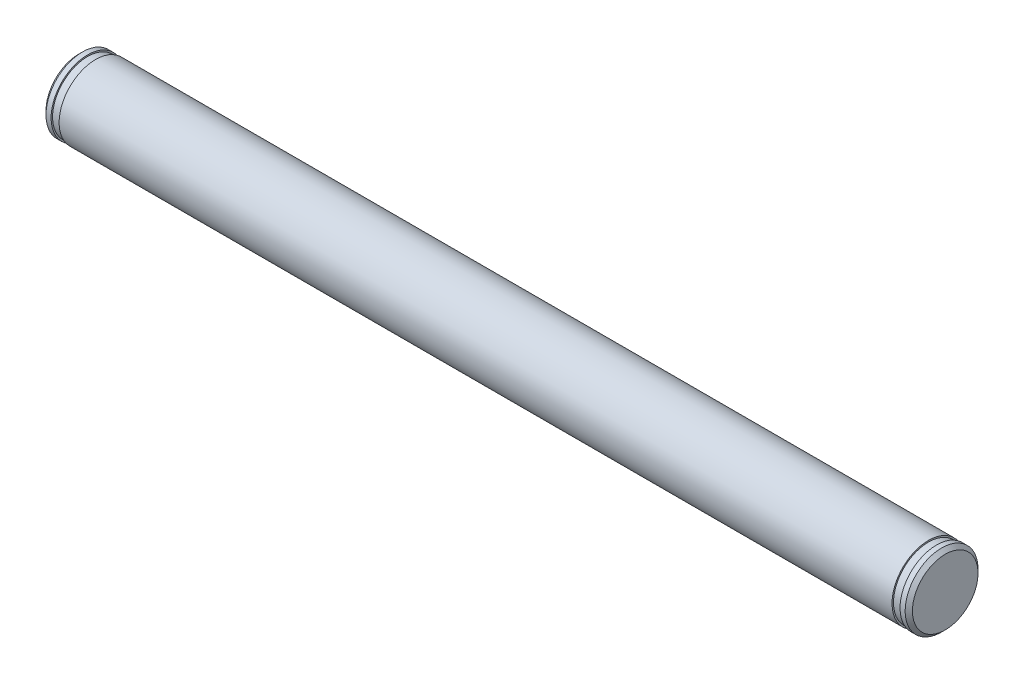
ISO-10303-21;
HEADER;
FILE_DESCRIPTION(('STEP AP214'),'2;1');
FILE_NAME('part.step','',(''),(''),'','','');
FILE_SCHEMA(('AUTOMOTIVE_DESIGN { 1 0 10303 214 1 1 1 1 }'));
ENDSEC;
DATA;
#1=APPLICATION_CONTEXT('core data for automotive mechanical design processes');
#2=APPLICATION_PROTOCOL_DEFINITION('international standard','automotive_design',2000,#1);
#3=PRODUCT_CONTEXT('',#1,'mechanical');
#4=PRODUCT('Part','Part','',(#3));
#5=PRODUCT_RELATED_PRODUCT_CATEGORY('part','',(#4));
#6=PRODUCT_DEFINITION_FORMATION('','',#4);
#7=PRODUCT_DEFINITION_CONTEXT('part definition',#1,'design');
#8=PRODUCT_DEFINITION('design','',#6,#7);
#9=PRODUCT_DEFINITION_SHAPE('','',#8);
#10=(LENGTH_UNIT() NAMED_UNIT(*) SI_UNIT(.MILLI.,.METRE.));
#11=(NAMED_UNIT(*) PLANE_ANGLE_UNIT() SI_UNIT($,.RADIAN.));
#12=(NAMED_UNIT(*) SI_UNIT($,.STERADIAN.) SOLID_ANGLE_UNIT());
#13=UNCERTAINTY_MEASURE_WITH_UNIT(LENGTH_MEASURE(1.E-05),#10,'distance_accuracy_value','');
#14=(GEOMETRIC_REPRESENTATION_CONTEXT(3) GLOBAL_UNCERTAINTY_ASSIGNED_CONTEXT((#13)) GLOBAL_UNIT_ASSIGNED_CONTEXT((#10,
#11,#12)) REPRESENTATION_CONTEXT('',''));
#15=CARTESIAN_POINT('',(0.,0.,0.));
#16=DIRECTION('',(0.,0.,1.));
#17=DIRECTION('',(1.,0.,0.));
#18=AXIS2_PLACEMENT_3D('',#15,#16,#17);
#19=CARTESIAN_POINT('',(-59.45,0.,0.));
#20=DIRECTION('',(-1.,0.,0.));
#21=DIRECTION('',(0.,-1.,0.));
#22=AXIS2_PLACEMENT_3D('',#19,#20,#21);
#23=PLANE('',#22);
#24=CARTESIAN_POINT('',(-59.45,0.,0.));
#25=DIRECTION('',(-1.,0.,0.));
#26=DIRECTION('',(0.,-1.,0.));
#27=AXIS2_PLACEMENT_3D('',#24,#25,#26);
#28=CIRCLE('',#27,4.49999999999999);
#29=CARTESIAN_POINT('',(-59.45,-4.49999999999999,0.));
#30=VERTEX_POINT('',#29);
#31=EDGE_CURVE('E10',#30,#30,#28,.T.);
#32=ORIENTED_EDGE('',*,*,#31,.T.);
#33=EDGE_LOOP('',(#32));
#34=FACE_BOUND('',#33,.T.);
#35=ADVANCED_FACE('F36',(#34),#23,.T.);
#36=CARTESIAN_POINT('',(59.45,0.,0.));
#37=DIRECTION('',(1.,0.,0.));
#38=DIRECTION('',(0.,1.,0.));
#39=AXIS2_PLACEMENT_3D('',#36,#37,#38);
#40=CYLINDRICAL_SURFACE('',#39,4.99999999999999);
#41=CARTESIAN_POINT('',(-58.95,0.,0.));
#42=DIRECTION('',(-1.,0.,0.));
#43=DIRECTION('',(0.,-1.,0.));
#44=AXIS2_PLACEMENT_3D('',#41,#42,#43);
#45=CIRCLE('',#44,4.99999999999999);
#46=CARTESIAN_POINT('',(-58.95,-4.99999999999999,0.));
#47=VERTEX_POINT('',#46);
#48=EDGE_CURVE('E44',#47,#47,#45,.F.);
#49=ORIENTED_EDGE('',*,*,#48,.T.);
#50=EDGE_LOOP('',(#49));
#51=FACE_BOUND('',#50,.T.);
#52=CARTESIAN_POINT('',(-58.25,0.,0.));
#53=DIRECTION('',(1.,0.,0.));
#54=DIRECTION('',(0.,1.,0.));
#55=AXIS2_PLACEMENT_3D('',#52,#53,#54);
#56=CIRCLE('',#55,4.99999999999999);
#57=CARTESIAN_POINT('',(-58.25,4.99999999999999,0.));
#58=VERTEX_POINT('',#57);
#59=EDGE_CURVE('E57',#58,#58,#56,.T.);
#60=ORIENTED_EDGE('',*,*,#59,.F.);
#61=EDGE_LOOP('',(#60));
#62=FACE_BOUND('',#61,.T.);
#63=ADVANCED_FACE('F100',(#51,#62),#40,.T.);
#64=CARTESIAN_POINT('',(-58.25,4.99999999999999,0.));
#65=DIRECTION('',(1.,0.,0.));
#66=DIRECTION('',(0.,1.,0.));
#67=AXIS2_PLACEMENT_3D('',#64,#65,#66);
#68=PLANE('',#67);
#69=ORIENTED_EDGE('',*,*,#59,.T.);
#70=EDGE_LOOP('',(#69));
#71=FACE_BOUND('',#70,.T.);
#72=CARTESIAN_POINT('',(-58.25,0.,0.));
#73=DIRECTION('',(1.,0.,0.));
#74=DIRECTION('',(0.,1.,0.));
#75=AXIS2_PLACEMENT_3D('',#72,#73,#74);
#76=CIRCLE('',#75,4.79999999999999);
#77=CARTESIAN_POINT('',(-58.25,4.79999999999999,0.));
#78=VERTEX_POINT('',#77);
#79=EDGE_CURVE('E60',#78,#78,#76,.T.);
#80=ORIENTED_EDGE('',*,*,#79,.F.);
#81=EDGE_LOOP('',(#80));
#82=FACE_BOUND('',#81,.T.);
#83=ADVANCED_FACE('F105',(#71,#82),#68,.T.);
#84=CARTESIAN_POINT('',(59.45,0.,0.));
#85=DIRECTION('',(1.,0.,0.));
#86=DIRECTION('',(0.,1.,0.));
#87=AXIS2_PLACEMENT_3D('',#84,#85,#86);
#88=CYLINDRICAL_SURFACE('',#87,4.79999999999999);
#89=ORIENTED_EDGE('',*,*,#79,.T.);
#90=EDGE_LOOP('',(#89));
#91=FACE_BOUND('',#90,.T.);
#92=CARTESIAN_POINT('',(-57.15,0.,0.));
#93=DIRECTION('',(1.,0.,0.));
#94=DIRECTION('',(0.,1.,0.));
#95=AXIS2_PLACEMENT_3D('',#92,#93,#94);
#96=CIRCLE('',#95,4.79999999999999);
#97=CARTESIAN_POINT('',(-57.15,4.79999999999999,0.));
#98=VERTEX_POINT('',#97);
#99=EDGE_CURVE('E63',#98,#98,#96,.T.);
#100=ORIENTED_EDGE('',*,*,#99,.F.);
#101=EDGE_LOOP('',(#100));
#102=FACE_BOUND('',#101,.T.);
#103=ADVANCED_FACE('F181',(#91,#102),#88,.T.);
#104=CARTESIAN_POINT('',(-57.15,4.79999999999999,0.));
#105=DIRECTION('',(-1.,0.,0.));
#106=DIRECTION('',(0.,-1.,0.));
#107=AXIS2_PLACEMENT_3D('',#104,#105,#106);
#108=PLANE('',#107);
#109=ORIENTED_EDGE('',*,*,#99,.T.);
#110=EDGE_LOOP('',(#109));
#111=FACE_BOUND('',#110,.T.);
#112=CARTESIAN_POINT('',(-57.15,0.,0.));
#113=DIRECTION('',(1.,0.,0.));
#114=DIRECTION('',(0.,1.,0.));
#115=AXIS2_PLACEMENT_3D('',#112,#113,#114);
#116=CIRCLE('',#115,4.99999999999999);
#117=CARTESIAN_POINT('',(-57.15,4.99999999999999,0.));
#118=VERTEX_POINT('',#117);
#119=EDGE_CURVE('E66',#118,#118,#116,.T.);
#120=ORIENTED_EDGE('',*,*,#119,.F.);
#121=EDGE_LOOP('',(#120));
#122=FACE_BOUND('',#121,.T.);
#123=ADVANCED_FACE('F171',(#111,#122),#108,.T.);
#124=CARTESIAN_POINT('',(59.45,0.,0.));
#125=DIRECTION('',(1.,0.,0.));
#126=DIRECTION('',(0.,1.,0.));
#127=AXIS2_PLACEMENT_3D('',#124,#125,#126);
#128=CYLINDRICAL_SURFACE('',#127,4.99999999999999);
#129=ORIENTED_EDGE('',*,*,#119,.T.);
#130=EDGE_LOOP('',(#129));
#131=FACE_BOUND('',#130,.T.);
#132=CARTESIAN_POINT('',(57.15,0.,0.));
#133=DIRECTION('',(1.,0.,0.));
#134=DIRECTION('',(0.,1.,0.));
#135=AXIS2_PLACEMENT_3D('',#132,#133,#134);
#136=CIRCLE('',#135,4.99999999999999);
#137=CARTESIAN_POINT('',(57.15,5.00000000000001,0.));
#138=VERTEX_POINT('',#137);
#139=EDGE_CURVE('E69',#138,#138,#136,.T.);
#140=ORIENTED_EDGE('',*,*,#139,.F.);
#141=EDGE_LOOP('',(#140));
#142=FACE_BOUND('',#141,.T.);
#143=ADVANCED_FACE('F161',(#131,#142),#128,.T.);
#144=CARTESIAN_POINT('',(57.15,4.80000000000001,0.));
#145=DIRECTION('',(1.,0.,0.));
#146=DIRECTION('',(0.,1.,0.));
#147=AXIS2_PLACEMENT_3D('',#144,#145,#146);
#148=PLANE('',#147);
#149=ORIENTED_EDGE('',*,*,#139,.T.);
#150=EDGE_LOOP('',(#149));
#151=FACE_BOUND('',#150,.T.);
#152=CARTESIAN_POINT('',(57.15,0.,0.));
#153=DIRECTION('',(1.,0.,0.));
#154=DIRECTION('',(0.,1.,0.));
#155=AXIS2_PLACEMENT_3D('',#152,#153,#154);
#156=CIRCLE('',#155,4.79999999999999);
#157=CARTESIAN_POINT('',(57.15,4.8,0.));
#158=VERTEX_POINT('',#157);
#159=EDGE_CURVE('E72',#158,#158,#156,.T.);
#160=ORIENTED_EDGE('',*,*,#159,.F.);
#161=EDGE_LOOP('',(#160));
#162=FACE_BOUND('',#161,.T.);
#163=ADVANCED_FACE('F96',(#151,#162),#148,.T.);
#164=CARTESIAN_POINT('',(59.45,0.,0.));
#165=DIRECTION('',(1.,0.,0.));
#166=DIRECTION('',(0.,1.,0.));
#167=AXIS2_PLACEMENT_3D('',#164,#165,#166);
#168=CYLINDRICAL_SURFACE('',#167,4.79999999999999);
#169=ORIENTED_EDGE('',*,*,#159,.T.);
#170=EDGE_LOOP('',(#169));
#171=FACE_BOUND('',#170,.T.);
#172=CARTESIAN_POINT('',(58.25,0.,0.));
#173=DIRECTION('',(1.,0.,0.));
#174=DIRECTION('',(0.,1.,0.));
#175=AXIS2_PLACEMENT_3D('',#172,#173,#174);
#176=CIRCLE('',#175,4.79999999999999);
#177=CARTESIAN_POINT('',(58.25,4.80000000000001,0.));
#178=VERTEX_POINT('',#177);
#179=EDGE_CURVE('E75',#178,#178,#176,.T.);
#180=ORIENTED_EDGE('',*,*,#179,.F.);
#181=EDGE_LOOP('',(#180));
#182=FACE_BOUND('',#181,.T.);
#183=ADVANCED_FACE('F86',(#171,#182),#168,.T.);
#184=CARTESIAN_POINT('',(58.25,5.00000000000001,0.));
#185=DIRECTION('',(-1.,0.,0.));
#186=DIRECTION('',(0.,-1.,0.));
#187=AXIS2_PLACEMENT_3D('',#184,#185,#186);
#188=PLANE('',#187);
#189=ORIENTED_EDGE('',*,*,#179,.T.);
#190=EDGE_LOOP('',(#189));
#191=FACE_BOUND('',#190,.T.);
#192=CARTESIAN_POINT('',(58.25,0.,0.));
#193=DIRECTION('',(1.,0.,0.));
#194=DIRECTION('',(0.,1.,0.));
#195=AXIS2_PLACEMENT_3D('',#192,#193,#194);
#196=CIRCLE('',#195,4.99999999999999);
#197=CARTESIAN_POINT('',(58.25,5.00000000000001,0.));
#198=VERTEX_POINT('',#197);
#199=EDGE_CURVE('E78',#198,#198,#196,.T.);
#200=ORIENTED_EDGE('',*,*,#199,.F.);
#201=EDGE_LOOP('',(#200));
#202=FACE_BOUND('',#201,.T.);
#203=ADVANCED_FACE('F84',(#191,#202),#188,.T.);
#204=CARTESIAN_POINT('',(59.45,0.,0.));
#205=DIRECTION('',(1.,0.,0.));
#206=DIRECTION('',(0.,1.,0.));
#207=AXIS2_PLACEMENT_3D('',#204,#205,#206);
#208=CYLINDRICAL_SURFACE('',#207,4.99999999999999);
#209=CARTESIAN_POINT('',(58.95,0.,0.));
#210=DIRECTION('',(1.,0.,0.));
#211=DIRECTION('',(0.,1.,0.));
#212=AXIS2_PLACEMENT_3D('',#209,#210,#211);
#213=CIRCLE('',#212,4.99999999999999);
#214=CARTESIAN_POINT('',(58.95,5.00000000000001,0.));
#215=VERTEX_POINT('',#214);
#216=EDGE_CURVE('E48',#215,#215,#213,.F.);
#217=ORIENTED_EDGE('',*,*,#216,.T.);
#218=EDGE_LOOP('',(#217));
#219=FACE_BOUND('',#218,.T.);
#220=ORIENTED_EDGE('',*,*,#199,.T.);
#221=EDGE_LOOP('',(#220));
#222=FACE_BOUND('',#221,.T.);
#223=ADVANCED_FACE('F82',(#219,#222),#208,.T.);
#224=CARTESIAN_POINT('',(59.45,0.,0.));
#225=DIRECTION('',(1.,0.,0.));
#226=DIRECTION('',(0.,1.,0.));
#227=AXIS2_PLACEMENT_3D('',#224,#225,#226);
#228=PLANE('',#227);
#229=CARTESIAN_POINT('',(59.45,0.,0.));
#230=DIRECTION('',(1.,0.,0.));
#231=DIRECTION('',(0.,1.,0.));
#232=AXIS2_PLACEMENT_3D('',#229,#230,#231);
#233=CIRCLE('',#232,4.49999999999999);
#234=CARTESIAN_POINT('',(59.45,4.5,0.));
#235=VERTEX_POINT('',#234);
#236=EDGE_CURVE('E52',#235,#235,#233,.T.);
#237=ORIENTED_EDGE('',*,*,#236,.T.);
#238=EDGE_LOOP('',(#237));
#239=FACE_BOUND('',#238,.T.);
#240=ADVANCED_FACE('F93',(#239),#228,.T.);
#241=CARTESIAN_POINT('',(59.45,0.,0.));
#242=DIRECTION('',(-1.,0.,0.));
#243=DIRECTION('',(0.,-1.,0.));
#244=AXIS2_PLACEMENT_3D('',#241,#242,#243);
#245=CONICAL_SURFACE('',#244,4.49999999999999,0.785398163397456);
#246=ORIENTED_EDGE('',*,*,#216,.F.);
#247=EDGE_LOOP('',(#246));
#248=FACE_BOUND('',#247,.T.);
#249=ORIENTED_EDGE('',*,*,#236,.F.);
#250=EDGE_LOOP('',(#249));
#251=FACE_BOUND('',#250,.T.);
#252=ADVANCED_FACE('F109',(#248,#251),#245,.T.);
#253=CARTESIAN_POINT('',(-58.95,0.,0.));
#254=DIRECTION('',(1.,0.,0.));
#255=DIRECTION('',(0.,1.,0.));
#256=AXIS2_PLACEMENT_3D('',#253,#254,#255);
#257=CONICAL_SURFACE('',#256,4.99999999999999,0.785398163397449);
#258=ORIENTED_EDGE('',*,*,#31,.F.);
#259=EDGE_LOOP('',(#258));
#260=FACE_BOUND('',#259,.T.);
#261=ORIENTED_EDGE('',*,*,#48,.F.);
#262=EDGE_LOOP('',(#261));
#263=FACE_BOUND('',#262,.T.);
#264=ADVANCED_FACE('F39',(#260,#263),#257,.T.);
#265=CLOSED_SHELL('',(#35,#63,#83,#103,#123,#143,#163,#183,#203,#223,#240,#252,#264));
#266=MANIFOLD_SOLID_BREP('B2',#265);
#267=ADVANCED_BREP_SHAPE_REPRESENTATION('',(#18,#266),#14);
#268=SHAPE_DEFINITION_REPRESENTATION(#9,#267);
ENDSEC;
END-ISO-10303-21;
